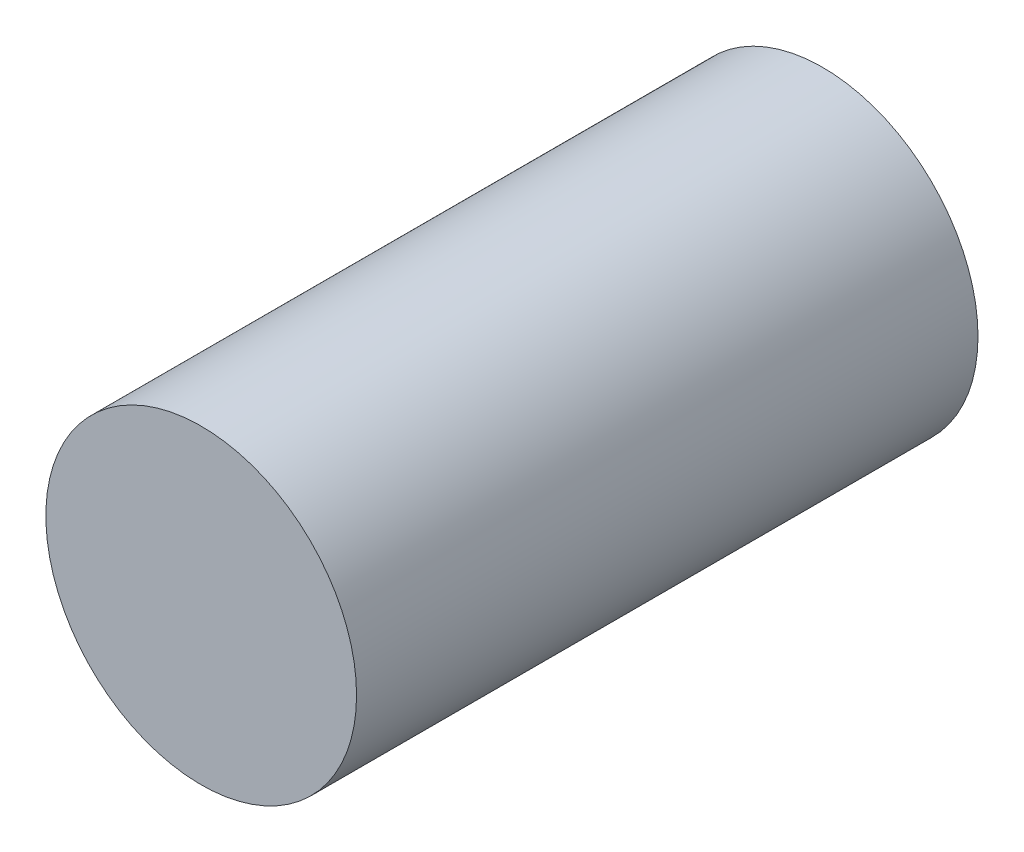
ISO-10303-21;
HEADER;
FILE_DESCRIPTION(('STEP AP214'),'2;1');
FILE_NAME('part.step','',(''),(''),'','','');
FILE_SCHEMA(('AUTOMOTIVE_DESIGN { 1 0 10303 214 1 1 1 1 }'));
ENDSEC;
DATA;
#1=APPLICATION_CONTEXT('core data for automotive mechanical design processes');
#2=APPLICATION_PROTOCOL_DEFINITION('international standard','automotive_design',2000,#1);
#3=PRODUCT_CONTEXT('',#1,'mechanical');
#4=PRODUCT('Part','Part','',(#3));
#5=PRODUCT_RELATED_PRODUCT_CATEGORY('part','',(#4));
#6=PRODUCT_DEFINITION_FORMATION('','',#4);
#7=PRODUCT_DEFINITION_CONTEXT('part definition',#1,'design');
#8=PRODUCT_DEFINITION('design','',#6,#7);
#9=PRODUCT_DEFINITION_SHAPE('','',#8);
#10=(LENGTH_UNIT() NAMED_UNIT(*) SI_UNIT(.MILLI.,.METRE.));
#11=(NAMED_UNIT(*) PLANE_ANGLE_UNIT() SI_UNIT($,.RADIAN.));
#12=(NAMED_UNIT(*) SI_UNIT($,.STERADIAN.) SOLID_ANGLE_UNIT());
#13=UNCERTAINTY_MEASURE_WITH_UNIT(LENGTH_MEASURE(1.E-05),#10,'distance_accuracy_value','');
#14=(GEOMETRIC_REPRESENTATION_CONTEXT(3) GLOBAL_UNCERTAINTY_ASSIGNED_CONTEXT((#13)) GLOBAL_UNIT_ASSIGNED_CONTEXT((#10,
#11,#12)) REPRESENTATION_CONTEXT('',''));
#15=CARTESIAN_POINT('',(0.,0.,0.));
#16=DIRECTION('',(0.,0.,1.));
#17=DIRECTION('',(1.,0.,0.));
#18=AXIS2_PLACEMENT_3D('',#15,#16,#17);
#19=CARTESIAN_POINT('',(0.,0.,6.35));
#20=DIRECTION('',(0.,0.,-1.));
#21=DIRECTION('',(-1.,0.,0.));
#22=AXIS2_PLACEMENT_3D('',#19,#20,#21);
#23=CYLINDRICAL_SURFACE('',#22,1.5875);
#24=CARTESIAN_POINT('',(0.,0.,6.35));
#25=DIRECTION('',(0.,0.,1.));
#26=DIRECTION('',(1.,0.,0.));
#27=AXIS2_PLACEMENT_3D('',#24,#25,#26);
#28=CIRCLE('',#27,1.5875);
#29=CARTESIAN_POINT('',(1.5875,0.,6.35));
#30=VERTEX_POINT('',#29);
#31=EDGE_CURVE('E10',#30,#30,#28,.T.);
#32=ORIENTED_EDGE('',*,*,#31,.F.);
#33=EDGE_LOOP('',(#32));
#34=FACE_BOUND('',#33,.T.);
#35=CARTESIAN_POINT('',(0.,0.,0.));
#36=DIRECTION('',(0.,0.,1.));
#37=DIRECTION('',(1.,0.,0.));
#38=AXIS2_PLACEMENT_3D('',#35,#36,#37);
#39=CIRCLE('',#38,1.5875);
#40=CARTESIAN_POINT('',(1.5875,0.,0.));
#41=VERTEX_POINT('',#40);
#42=EDGE_CURVE('E42',#41,#41,#39,.T.);
#43=ORIENTED_EDGE('',*,*,#42,.T.);
#44=EDGE_LOOP('',(#43));
#45=FACE_BOUND('',#44,.T.);
#46=ADVANCED_FACE('F39',(#34,#45),#23,.T.);
#47=CARTESIAN_POINT('',(0.,0.,6.35));
#48=DIRECTION('',(0.,0.,1.));
#49=DIRECTION('',(1.,0.,0.));
#50=AXIS2_PLACEMENT_3D('',#47,#48,#49);
#51=PLANE('',#50);
#52=ORIENTED_EDGE('',*,*,#31,.T.);
#53=EDGE_LOOP('',(#52));
#54=FACE_BOUND('',#53,.T.);
#55=ADVANCED_FACE('F56',(#54),#51,.T.);
#56=CARTESIAN_POINT('',(0.,0.,0.));
#57=DIRECTION('',(0.,0.,1.));
#58=DIRECTION('',(1.,0.,0.));
#59=AXIS2_PLACEMENT_3D('',#56,#57,#58);
#60=PLANE('',#59);
#61=ORIENTED_EDGE('',*,*,#42,.F.);
#62=EDGE_LOOP('',(#61));
#63=FACE_BOUND('',#62,.T.);
#64=ADVANCED_FACE('F54',(#63),#60,.F.);
#65=CLOSED_SHELL('',(#46,#55,#64));
#66=MANIFOLD_SOLID_BREP('B2',#65);
#67=ADVANCED_BREP_SHAPE_REPRESENTATION('',(#18,#66),#14);
#68=SHAPE_DEFINITION_REPRESENTATION(#9,#67);
ENDSEC;
END-ISO-10303-21;
